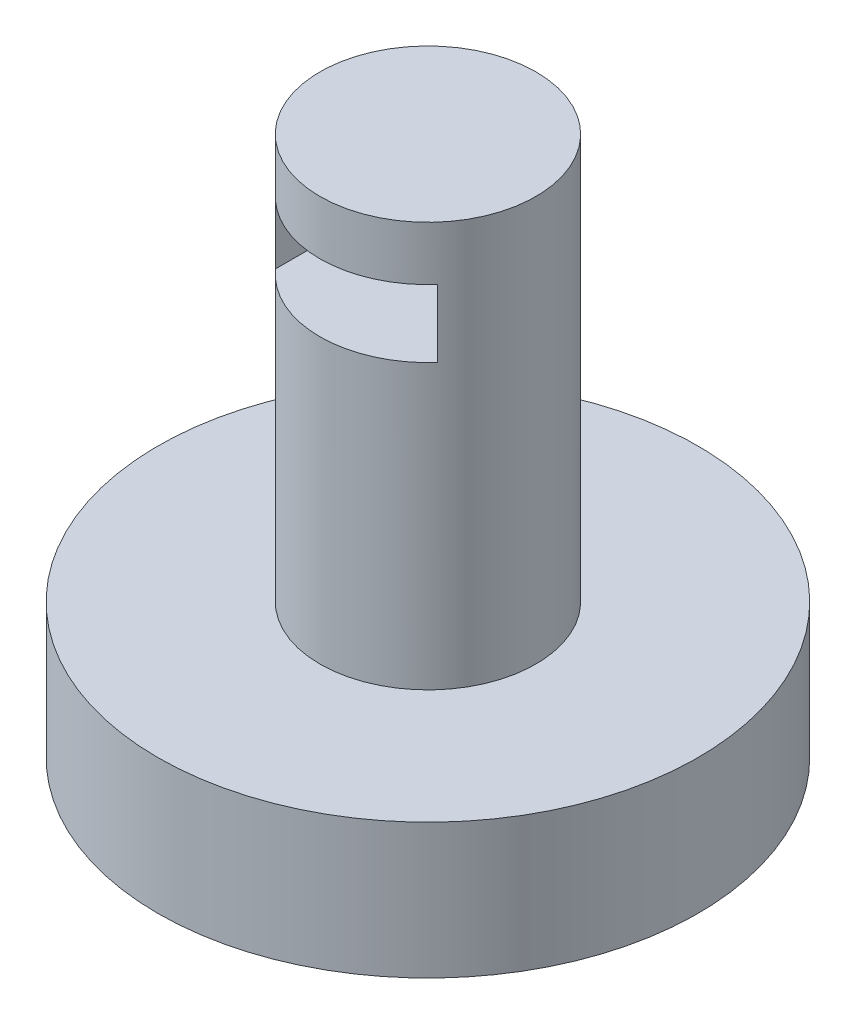
ISO-10303-21;
HEADER;
FILE_DESCRIPTION(('STEP AP214'),'2;1');
FILE_NAME('part.step','',(''),(''),'','','');
FILE_SCHEMA(('AUTOMOTIVE_DESIGN { 1 0 10303 214 1 1 1 1 }'));
ENDSEC;
DATA;
#1=APPLICATION_CONTEXT('core data for automotive mechanical design processes');
#2=APPLICATION_PROTOCOL_DEFINITION('international standard','automotive_design',2000,#1);
#3=PRODUCT_CONTEXT('',#1,'mechanical');
#4=PRODUCT('Part','Part','',(#3));
#5=PRODUCT_RELATED_PRODUCT_CATEGORY('part','',(#4));
#6=PRODUCT_DEFINITION_FORMATION('','',#4);
#7=PRODUCT_DEFINITION_CONTEXT('part definition',#1,'design');
#8=PRODUCT_DEFINITION('design','',#6,#7);
#9=PRODUCT_DEFINITION_SHAPE('','',#8);
#10=(LENGTH_UNIT() NAMED_UNIT(*) SI_UNIT(.MILLI.,.METRE.));
#11=(NAMED_UNIT(*) PLANE_ANGLE_UNIT() SI_UNIT($,.RADIAN.));
#12=(NAMED_UNIT(*) SI_UNIT($,.STERADIAN.) SOLID_ANGLE_UNIT());
#13=UNCERTAINTY_MEASURE_WITH_UNIT(LENGTH_MEASURE(1.E-05),#10,'distance_accuracy_value','');
#14=(GEOMETRIC_REPRESENTATION_CONTEXT(3) GLOBAL_UNCERTAINTY_ASSIGNED_CONTEXT((#13)) GLOBAL_UNIT_ASSIGNED_CONTEXT((#10,
#11,#12)) REPRESENTATION_CONTEXT('',''));
#15=CARTESIAN_POINT('',(0.,0.,0.));
#16=DIRECTION('',(0.,0.,1.));
#17=DIRECTION('',(1.,0.,0.));
#18=AXIS2_PLACEMENT_3D('',#15,#16,#17);
#19=CARTESIAN_POINT('',(0.,40.,0.));
#20=DIRECTION('',(0.,-1.,0.));
#21=DIRECTION('',(0.,0.,-1.));
#22=AXIS2_PLACEMENT_3D('',#19,#20,#21);
#23=CYLINDRICAL_SURFACE('',#22,8.);
#24=DIRECTION('',(0.,-1.,0.));
#25=VECTOR('',#24,1.);
#26=CARTESIAN_POINT('',(-6.,40.,-5.29150262212918));
#27=LINE('',#26,#25);
#28=CARTESIAN_POINT('',(-6.,31.,-5.29150262212918));
#29=VERTEX_POINT('',#28);
#30=CARTESIAN_POINT('',(-6.,36.,-5.29150262212918));
#31=VERTEX_POINT('',#30);
#32=EDGE_CURVE('E103',#29,#31,#27,.F.);
#33=ORIENTED_EDGE('',*,*,#32,.F.);
#34=CARTESIAN_POINT('',(0.,31.,0.));
#35=DIRECTION('',(0.,1.,0.));
#36=DIRECTION('',(0.,0.,1.));
#37=AXIS2_PLACEMENT_3D('',#34,#35,#36);
#38=CIRCLE('',#37,8.);
#39=CARTESIAN_POINT('',(6.,31.,-5.29150262212918));
#40=VERTEX_POINT('',#39);
#41=EDGE_CURVE('E99',#40,#29,#38,.T.);
#42=ORIENTED_EDGE('',*,*,#41,.F.);
#43=DIRECTION('',(0.,-1.,0.));
#44=VECTOR('',#43,1.);
#45=CARTESIAN_POINT('',(6.,40.,-5.29150262212918));
#46=LINE('',#45,#44);
#47=CARTESIAN_POINT('',(6.,36.,-5.29150262212918));
#48=VERTEX_POINT('',#47);
#49=EDGE_CURVE('E83',#48,#40,#46,.T.);
#50=ORIENTED_EDGE('',*,*,#49,.F.);
#51=CARTESIAN_POINT('',(0.,36.,0.));
#52=DIRECTION('',(0.,-1.,0.));
#53=DIRECTION('',(0.,0.,-1.));
#54=AXIS2_PLACEMENT_3D('',#51,#52,#53);
#55=CIRCLE('',#54,8.);
#56=EDGE_CURVE('E77',#31,#48,#55,.T.);
#57=ORIENTED_EDGE('',*,*,#56,.F.);
#58=EDGE_LOOP('',(#33,#42,#50,#57));
#59=FACE_BOUND('',#58,.T.);
#60=CARTESIAN_POINT('',(0.,40.,0.));
#61=DIRECTION('',(0.,1.,0.));
#62=DIRECTION('',(0.,0.,1.));
#63=AXIS2_PLACEMENT_3D('',#60,#61,#62);
#64=CIRCLE('',#63,8.);
#65=CARTESIAN_POINT('',(0.,40.,8.));
#66=VERTEX_POINT('',#65);
#67=EDGE_CURVE('E127',#66,#66,#64,.T.);
#68=ORIENTED_EDGE('',*,*,#67,.F.);
#69=EDGE_LOOP('',(#68));
#70=FACE_BOUND('',#69,.T.);
#71=CARTESIAN_POINT('',(0.,10.,0.));
#72=DIRECTION('',(0.,1.,0.));
#73=DIRECTION('',(0.,0.,1.));
#74=AXIS2_PLACEMENT_3D('',#71,#72,#73);
#75=CIRCLE('',#74,8.);
#76=CARTESIAN_POINT('',(0.,10.,8.));
#77=VERTEX_POINT('',#76);
#78=EDGE_CURVE('E84',#77,#77,#75,.T.);
#79=ORIENTED_EDGE('',*,*,#78,.T.);
#80=EDGE_LOOP('',(#79));
#81=FACE_BOUND('',#80,.T.);
#82=DIRECTION('',(0.,-1.,0.));
#83=VECTOR('',#82,1.);
#84=CARTESIAN_POINT('',(-6.,40.,5.29150262212918));
#85=LINE('',#84,#83);
#86=CARTESIAN_POINT('',(-6.,36.,5.29150262212918));
#87=VERTEX_POINT('',#86);
#88=CARTESIAN_POINT('',(-6.,31.,5.29150262212918));
#89=VERTEX_POINT('',#88);
#90=EDGE_CURVE('E11',#87,#89,#85,.T.);
#91=ORIENTED_EDGE('',*,*,#90,.F.);
#92=CARTESIAN_POINT('',(6.,36.,5.29150262212918));
#93=VERTEX_POINT('',#92);
#94=EDGE_CURVE('E86',#93,#87,#55,.T.);
#95=ORIENTED_EDGE('',*,*,#94,.F.);
#96=DIRECTION('',(0.,-1.,0.));
#97=VECTOR('',#96,1.);
#98=CARTESIAN_POINT('',(6.,40.,5.29150262212918));
#99=LINE('',#98,#97);
#100=CARTESIAN_POINT('',(6.,31.,5.29150262212918));
#101=VERTEX_POINT('',#100);
#102=EDGE_CURVE('E92',#101,#93,#99,.F.);
#103=ORIENTED_EDGE('',*,*,#102,.F.);
#104=EDGE_CURVE('E48',#89,#101,#38,.T.);
#105=ORIENTED_EDGE('',*,*,#104,.F.);
#106=EDGE_LOOP('',(#91,#95,#103,#105));
#107=FACE_BOUND('',#106,.T.);
#108=ADVANCED_FACE('F39',(#59,#70,#81,#107),#23,.T.);
#109=CARTESIAN_POINT('',(0.,10.,0.));
#110=DIRECTION('',(0.,-1.,0.));
#111=DIRECTION('',(0.,0.,-1.));
#112=AXIS2_PLACEMENT_3D('',#109,#110,#111);
#113=CYLINDRICAL_SURFACE('',#112,20.);
#114=CARTESIAN_POINT('',(0.,10.,0.));
#115=DIRECTION('',(0.,1.,0.));
#116=DIRECTION('',(0.,0.,1.));
#117=AXIS2_PLACEMENT_3D('',#114,#115,#116);
#118=CIRCLE('',#117,20.);
#119=CARTESIAN_POINT('',(0.,10.,20.));
#120=VERTEX_POINT('',#119);
#121=EDGE_CURVE('E137',#120,#120,#118,.T.);
#122=ORIENTED_EDGE('',*,*,#121,.F.);
#123=EDGE_LOOP('',(#122));
#124=FACE_BOUND('',#123,.T.);
#125=CARTESIAN_POINT('',(0.,0.,0.));
#126=DIRECTION('',(0.,1.,0.));
#127=DIRECTION('',(0.,0.,1.));
#128=AXIS2_PLACEMENT_3D('',#125,#126,#127);
#129=CIRCLE('',#128,20.);
#130=CARTESIAN_POINT('',(0.,0.,20.));
#131=VERTEX_POINT('',#130);
#132=EDGE_CURVE('E133',#131,#131,#129,.T.);
#133=ORIENTED_EDGE('',*,*,#132,.T.);
#134=EDGE_LOOP('',(#133));
#135=FACE_BOUND('',#134,.T.);
#136=ADVANCED_FACE('F41',(#124,#135),#113,.T.);
#137=CARTESIAN_POINT('',(0.,10.,0.));
#138=DIRECTION('',(0.,1.,0.));
#139=DIRECTION('',(0.,0.,1.));
#140=AXIS2_PLACEMENT_3D('',#137,#138,#139);
#141=PLANE('',#140);
#142=ORIENTED_EDGE('',*,*,#78,.F.);
#143=EDGE_LOOP('',(#142));
#144=FACE_BOUND('',#143,.T.);
#145=ORIENTED_EDGE('',*,*,#121,.T.);
#146=EDGE_LOOP('',(#145));
#147=FACE_BOUND('',#146,.T.);
#148=ADVANCED_FACE('F148',(#144,#147),#141,.T.);
#149=CARTESIAN_POINT('',(0.,0.,0.));
#150=DIRECTION('',(0.,1.,0.));
#151=DIRECTION('',(0.,0.,1.));
#152=AXIS2_PLACEMENT_3D('',#149,#150,#151);
#153=PLANE('',#152);
#154=CARTESIAN_POINT('',(0.,0.,0.));
#155=DIRECTION('',(0.,-1.,0.));
#156=DIRECTION('',(0.,0.,-1.));
#157=AXIS2_PLACEMENT_3D('',#154,#155,#156);
#158=CIRCLE('',#157,4.);
#159=CARTESIAN_POINT('',(0.,0.,-4.));
#160=VERTEX_POINT('',#159);
#161=EDGE_CURVE('E188',#160,#160,#158,.T.);
#162=ORIENTED_EDGE('',*,*,#161,.F.);
#163=EDGE_LOOP('',(#162));
#164=FACE_BOUND('',#163,.T.);
#165=ORIENTED_EDGE('',*,*,#132,.F.);
#166=EDGE_LOOP('',(#165));
#167=FACE_BOUND('',#166,.T.);
#168=ADVANCED_FACE('F145',(#164,#167),#153,.F.);
#169=CARTESIAN_POINT('',(0.,40.,0.));
#170=DIRECTION('',(0.,1.,0.));
#171=DIRECTION('',(0.,0.,1.));
#172=AXIS2_PLACEMENT_3D('',#169,#170,#171);
#173=PLANE('',#172);
#174=ORIENTED_EDGE('',*,*,#67,.T.);
#175=EDGE_LOOP('',(#174));
#176=FACE_BOUND('',#175,.T.);
#177=ADVANCED_FACE('F147',(#176),#173,.T.);
#178=CARTESIAN_POINT('',(-6.,36.,20.));
#179=DIRECTION('',(1.,0.,0.));
#180=DIRECTION('',(0.,1.,0.));
#181=AXIS2_PLACEMENT_3D('',#178,#179,#180);
#182=PLANE('',#181);
#183=ORIENTED_EDGE('',*,*,#90,.T.);
#184=DIRECTION('',(0.,0.,-1.));
#185=VECTOR('',#184,1.);
#186=CARTESIAN_POINT('',(-6.,31.,20.));
#187=LINE('',#186,#185);
#188=EDGE_CURVE('E123',#89,#29,#187,.T.);
#189=ORIENTED_EDGE('',*,*,#188,.T.);
#190=ORIENTED_EDGE('',*,*,#32,.T.);
#191=DIRECTION('',(0.,0.,-1.));
#192=VECTOR('',#191,1.);
#193=CARTESIAN_POINT('',(-6.,36.,20.));
#194=LINE('',#193,#192);
#195=EDGE_CURVE('E60',#87,#31,#194,.T.);
#196=ORIENTED_EDGE('',*,*,#195,.F.);
#197=EDGE_LOOP('',(#183,#189,#190,#196));
#198=FACE_BOUND('',#197,.T.);
#199=ADVANCED_FACE('F114',(#198),#182,.T.);
#200=CARTESIAN_POINT('',(-6.,31.,20.));
#201=DIRECTION('',(0.,1.,0.));
#202=DIRECTION('',(0.,0.,1.));
#203=AXIS2_PLACEMENT_3D('',#200,#201,#202);
#204=PLANE('',#203);
#205=ORIENTED_EDGE('',*,*,#41,.T.);
#206=ORIENTED_EDGE('',*,*,#188,.F.);
#207=ORIENTED_EDGE('',*,*,#104,.T.);
#208=DIRECTION('',(0.,0.,-1.));
#209=VECTOR('',#208,1.);
#210=CARTESIAN_POINT('',(6.,31.,20.));
#211=LINE('',#210,#209);
#212=EDGE_CURVE('E95',#101,#40,#211,.T.);
#213=ORIENTED_EDGE('',*,*,#212,.T.);
#214=EDGE_LOOP('',(#205,#206,#207,#213));
#215=FACE_BOUND('',#214,.T.);
#216=ADVANCED_FACE('F122',(#215),#204,.T.);
#217=CARTESIAN_POINT('',(6.,36.,20.));
#218=DIRECTION('',(-1.,0.,0.));
#219=DIRECTION('',(0.,-1.,0.));
#220=AXIS2_PLACEMENT_3D('',#217,#218,#219);
#221=PLANE('',#220);
#222=ORIENTED_EDGE('',*,*,#49,.T.);
#223=ORIENTED_EDGE('',*,*,#212,.F.);
#224=ORIENTED_EDGE('',*,*,#102,.T.);
#225=DIRECTION('',(0.,0.,-1.));
#226=VECTOR('',#225,1.);
#227=CARTESIAN_POINT('',(6.,36.,20.));
#228=LINE('',#227,#226);
#229=EDGE_CURVE('E55',#93,#48,#228,.T.);
#230=ORIENTED_EDGE('',*,*,#229,.T.);
#231=EDGE_LOOP('',(#222,#223,#224,#230));
#232=FACE_BOUND('',#231,.T.);
#233=ADVANCED_FACE('F88',(#232),#221,.T.);
#234=CARTESIAN_POINT('',(-6.,36.,20.));
#235=DIRECTION('',(0.,-1.,0.));
#236=DIRECTION('',(0.,0.,-1.));
#237=AXIS2_PLACEMENT_3D('',#234,#235,#236);
#238=PLANE('',#237);
#239=ORIENTED_EDGE('',*,*,#94,.T.);
#240=ORIENTED_EDGE('',*,*,#195,.T.);
#241=ORIENTED_EDGE('',*,*,#56,.T.);
#242=ORIENTED_EDGE('',*,*,#229,.F.);
#243=EDGE_LOOP('',(#239,#240,#241,#242));
#244=FACE_BOUND('',#243,.T.);
#245=ADVANCED_FACE('F78',(#244),#238,.T.);
#246=CARTESIAN_POINT('',(0.,3.,0.));
#247=DIRECTION('',(0.,-1.,0.));
#248=DIRECTION('',(0.,0.,-1.));
#249=AXIS2_PLACEMENT_3D('',#246,#247,#248);
#250=CYLINDRICAL_SURFACE('',#249,4.);
#251=CARTESIAN_POINT('',(0.,3.,0.));
#252=DIRECTION('',(0.,-1.,0.));
#253=DIRECTION('',(0.,0.,-1.));
#254=AXIS2_PLACEMENT_3D('',#251,#252,#253);
#255=CIRCLE('',#254,4.);
#256=CARTESIAN_POINT('',(0.,3.,-4.));
#257=VERTEX_POINT('',#256);
#258=EDGE_CURVE('E118',#257,#257,#255,.T.);
#259=ORIENTED_EDGE('',*,*,#258,.F.);
#260=EDGE_LOOP('',(#259));
#261=FACE_BOUND('',#260,.T.);
#262=ORIENTED_EDGE('',*,*,#161,.T.);
#263=EDGE_LOOP('',(#262));
#264=FACE_BOUND('',#263,.T.);
#265=ADVANCED_FACE('F176',(#261,#264),#250,.F.);
#266=CARTESIAN_POINT('',(0.,3.,0.));
#267=DIRECTION('',(0.,-1.,0.));
#268=DIRECTION('',(0.,0.,-1.));
#269=AXIS2_PLACEMENT_3D('',#266,#267,#268);
#270=PLANE('',#269);
#271=ORIENTED_EDGE('',*,*,#258,.T.);
#272=EDGE_LOOP('',(#271));
#273=FACE_BOUND('',#272,.T.);
#274=ADVANCED_FACE('F179',(#273),#270,.T.);
#275=CLOSED_SHELL('',(#108,#136,#148,#168,#177,#199,#216,#233,#245,#265,#274));
#276=MANIFOLD_SOLID_BREP('B2',#275);
#277=ADVANCED_BREP_SHAPE_REPRESENTATION('',(#18,#276),#14);
#278=SHAPE_DEFINITION_REPRESENTATION(#9,#277);
ENDSEC;
END-ISO-10303-21;
